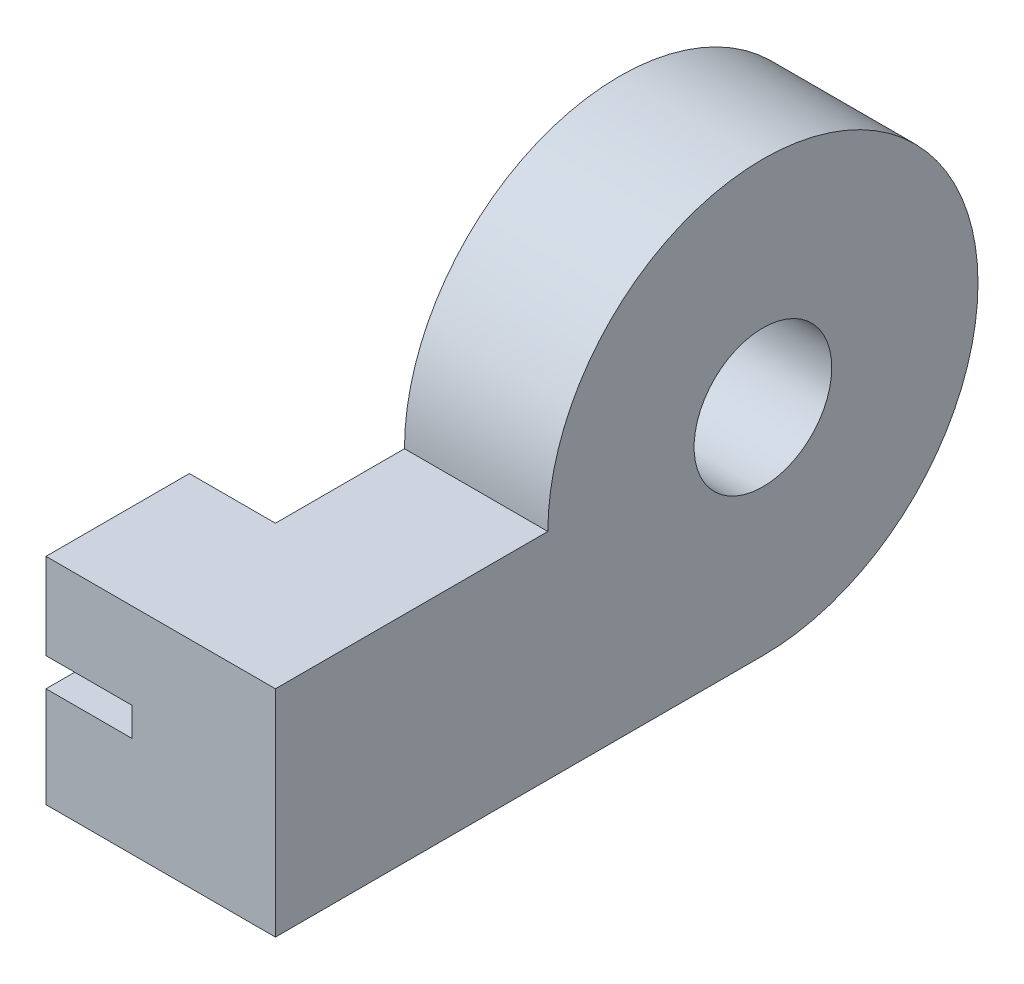
ISO-10303-21;
HEADER;
FILE_DESCRIPTION(('STEP AP214'),'2;1');
FILE_NAME('part.step','',(''),(''),'','','');
FILE_SCHEMA(('AUTOMOTIVE_DESIGN { 1 0 10303 214 1 1 1 1 }'));
ENDSEC;
DATA;
#1=APPLICATION_CONTEXT('core data for automotive mechanical design processes');
#2=APPLICATION_PROTOCOL_DEFINITION('international standard','automotive_design',2000,#1);
#3=PRODUCT_CONTEXT('',#1,'mechanical');
#4=PRODUCT('Part','Part','',(#3));
#5=PRODUCT_RELATED_PRODUCT_CATEGORY('part','',(#4));
#6=PRODUCT_DEFINITION_FORMATION('','',#4);
#7=PRODUCT_DEFINITION_CONTEXT('part definition',#1,'design');
#8=PRODUCT_DEFINITION('design','',#6,#7);
#9=PRODUCT_DEFINITION_SHAPE('','',#8);
#10=(LENGTH_UNIT() NAMED_UNIT(*) SI_UNIT(.MILLI.,.METRE.));
#11=(NAMED_UNIT(*) PLANE_ANGLE_UNIT() SI_UNIT($,.RADIAN.));
#12=(NAMED_UNIT(*) SI_UNIT($,.STERADIAN.) SOLID_ANGLE_UNIT());
#13=UNCERTAINTY_MEASURE_WITH_UNIT(LENGTH_MEASURE(1.E-05),#10,'distance_accuracy_value','');
#14=(GEOMETRIC_REPRESENTATION_CONTEXT(3) GLOBAL_UNCERTAINTY_ASSIGNED_CONTEXT((#13)) GLOBAL_UNIT_ASSIGNED_CONTEXT((#10,
#11,#12)) REPRESENTATION_CONTEXT('',''));
#15=CARTESIAN_POINT('',(0.,0.,0.));
#16=DIRECTION('',(0.,0.,1.));
#17=DIRECTION('',(1.,0.,0.));
#18=AXIS2_PLACEMENT_3D('',#15,#16,#17);
#19=CARTESIAN_POINT('',(0.,0.,0.));
#20=DIRECTION('',(1.,0.,0.));
#21=DIRECTION('',(0.,0.,-1.));
#22=AXIS2_PLACEMENT_3D('',#19,#20,#21);
#23=PLANE('',#22);
#24=CARTESIAN_POINT('',(0.,0.,0.));
#25=DIRECTION('',(1.,0.,0.));
#26=DIRECTION('',(0.,0.,-1.));
#27=AXIS2_PLACEMENT_3D('',#24,#25,#26);
#28=CIRCLE('',#27,3.048);
#29=CARTESIAN_POINT('',(0.,0.,-3.048));
#30=VERTEX_POINT('',#29);
#31=EDGE_CURVE('E190',#30,#30,#28,.T.);
#32=ORIENTED_EDGE('',*,*,#31,.T.);
#33=EDGE_LOOP('',(#32));
#34=FACE_BOUND('',#33,.T.);
#35=DIRECTION('',(0.,0.,-1.));
#36=VECTOR('',#35,1.);
#37=CARTESIAN_POINT('',(0.,-5.08000000000001,21.59));
#38=LINE('',#37,#36);
#39=CARTESIAN_POINT('',(0.,-5.08000000000001,21.59));
#40=VERTEX_POINT('',#39);
#41=CARTESIAN_POINT('',(0.,-5.08000000000001,15.24));
#42=VERTEX_POINT('',#41);
#43=EDGE_CURVE('E62',#40,#42,#38,.T.);
#44=ORIENTED_EDGE('',*,*,#43,.F.);
#45=DIRECTION('',(0.,1.,0.));
#46=VECTOR('',#45,1.);
#47=CARTESIAN_POINT('',(0.,0.,21.59));
#48=LINE('',#47,#46);
#49=CARTESIAN_POINT('',(0.,-3.81000000000001,21.59));
#50=VERTEX_POINT('',#49);
#51=EDGE_CURVE('E133',#40,#50,#48,.T.);
#52=ORIENTED_EDGE('',*,*,#51,.T.);
#53=DIRECTION('',(0.,0.,-1.));
#54=VECTOR('',#53,1.);
#55=CARTESIAN_POINT('',(0.,-3.81,21.59));
#56=LINE('',#55,#54);
#57=CARTESIAN_POINT('',(0.,-3.81000000000001,15.24));
#58=VERTEX_POINT('',#57);
#59=EDGE_CURVE('E173',#50,#58,#56,.T.);
#60=ORIENTED_EDGE('',*,*,#59,.T.);
#61=DIRECTION('',(0.,-1.,0.));
#62=VECTOR('',#61,1.);
#63=CARTESIAN_POINT('',(0.,0.,15.24));
#64=LINE('',#63,#62);
#65=CARTESIAN_POINT('',(0.,0.,15.24));
#66=VERTEX_POINT('',#65);
#67=EDGE_CURVE('E70',#66,#58,#64,.T.);
#68=ORIENTED_EDGE('',*,*,#67,.F.);
#69=DIRECTION('',(0.,0.,1.));
#70=VECTOR('',#69,1.);
#71=CARTESIAN_POINT('',(0.,0.,0.));
#72=LINE('',#71,#70);
#73=CARTESIAN_POINT('',(0.,0.,9.525));
#74=VERTEX_POINT('',#73);
#75=EDGE_CURVE('E145',#74,#66,#72,.T.);
#76=ORIENTED_EDGE('',*,*,#75,.F.);
#77=CARTESIAN_POINT('',(0.,0.,0.));
#78=DIRECTION('',(1.,0.,0.));
#79=DIRECTION('',(0.,0.,-1.));
#80=AXIS2_PLACEMENT_3D('',#77,#78,#79);
#81=CIRCLE('',#80,9.525);
#82=CARTESIAN_POINT('',(0.,-9.525,0.));
#83=VERTEX_POINT('',#82);
#84=EDGE_CURVE('E149',#83,#74,#81,.T.);
#85=ORIENTED_EDGE('',*,*,#84,.F.);
#86=DIRECTION('',(0.,0.,1.));
#87=VECTOR('',#86,1.);
#88=CARTESIAN_POINT('',(0.,-9.525,0.));
#89=LINE('',#88,#87);
#90=CARTESIAN_POINT('',(0.,-9.52500000000001,15.24));
#91=VERTEX_POINT('',#90);
#92=EDGE_CURVE('E144',#83,#91,#89,.T.);
#93=ORIENTED_EDGE('',*,*,#92,.T.);
#94=DIRECTION('',(0.,1.,0.));
#95=VECTOR('',#94,1.);
#96=CARTESIAN_POINT('',(0.,-9.52500000000001,15.24));
#97=LINE('',#96,#95);
#98=EDGE_CURVE('E137',#91,#42,#97,.T.);
#99=ORIENTED_EDGE('',*,*,#98,.T.);
#100=EDGE_LOOP('',(#44,#52,#60,#68,#76,#85,#93,#99));
#101=FACE_BOUND('',#100,.T.);
#102=ADVANCED_FACE('F47',(#34,#101),#23,.F.);
#103=CARTESIAN_POINT('',(6.35,0.,0.));
#104=DIRECTION('',(-1.,0.,0.));
#105=DIRECTION('',(0.,0.,1.));
#106=AXIS2_PLACEMENT_3D('',#103,#104,#105);
#107=CYLINDRICAL_SURFACE('',#106,9.525);
#108=ORIENTED_EDGE('',*,*,#84,.T.);
#109=DIRECTION('',(-1.,0.,0.));
#110=VECTOR('',#109,1.);
#111=CARTESIAN_POINT('',(6.35,0.,9.525));
#112=LINE('',#111,#110);
#113=CARTESIAN_POINT('',(6.35,0.,9.525));
#114=VERTEX_POINT('',#113);
#115=EDGE_CURVE('E13',#114,#74,#112,.T.);
#116=ORIENTED_EDGE('',*,*,#115,.F.);
#117=CARTESIAN_POINT('',(6.35,0.,0.));
#118=DIRECTION('',(1.,0.,0.));
#119=DIRECTION('',(0.,0.,-1.));
#120=AXIS2_PLACEMENT_3D('',#117,#118,#119);
#121=CIRCLE('',#120,9.525);
#122=CARTESIAN_POINT('',(6.35,-9.525,0.));
#123=VERTEX_POINT('',#122);
#124=EDGE_CURVE('E193',#123,#114,#121,.T.);
#125=ORIENTED_EDGE('',*,*,#124,.F.);
#126=DIRECTION('',(-1.,0.,0.));
#127=VECTOR('',#126,1.);
#128=CARTESIAN_POINT('',(6.35,-9.525,0.));
#129=LINE('',#128,#127);
#130=EDGE_CURVE('E153',#123,#83,#129,.T.);
#131=ORIENTED_EDGE('',*,*,#130,.T.);
#132=EDGE_LOOP('',(#108,#116,#125,#131));
#133=FACE_BOUND('',#132,.T.);
#134=ADVANCED_FACE('F206',(#133),#107,.T.);
#135=CARTESIAN_POINT('',(6.35,0.,0.));
#136=DIRECTION('',(0.,-1.,0.));
#137=DIRECTION('',(0.,0.,-1.));
#138=AXIS2_PLACEMENT_3D('',#135,#136,#137);
#139=PLANE('',#138);
#140=ORIENTED_EDGE('',*,*,#75,.T.);
#141=DIRECTION('',(1.,0.,0.));
#142=VECTOR('',#141,1.);
#143=CARTESIAN_POINT('',(-3.81,0.,15.24));
#144=LINE('',#143,#142);
#145=CARTESIAN_POINT('',(-3.81,0.,15.24));
#146=VERTEX_POINT('',#145);
#147=EDGE_CURVE('E170',#146,#66,#144,.T.);
#148=ORIENTED_EDGE('',*,*,#147,.F.);
#149=DIRECTION('',(0.,0.,-1.));
#150=VECTOR('',#149,1.);
#151=CARTESIAN_POINT('',(-3.81,0.,21.59));
#152=LINE('',#151,#150);
#153=CARTESIAN_POINT('',(-3.81,0.,21.59));
#154=VERTEX_POINT('',#153);
#155=EDGE_CURVE('E167',#154,#146,#152,.T.);
#156=ORIENTED_EDGE('',*,*,#155,.F.);
#157=DIRECTION('',(-1.,0.,0.));
#158=VECTOR('',#157,1.);
#159=CARTESIAN_POINT('',(6.35,0.,21.59));
#160=LINE('',#159,#158);
#161=CARTESIAN_POINT('',(6.35,0.,21.59));
#162=VERTEX_POINT('',#161);
#163=EDGE_CURVE('E55',#162,#154,#160,.T.);
#164=ORIENTED_EDGE('',*,*,#163,.F.);
#165=DIRECTION('',(0.,0.,1.));
#166=VECTOR('',#165,1.);
#167=CARTESIAN_POINT('',(6.35,0.,0.));
#168=LINE('',#167,#166);
#169=EDGE_CURVE('E196',#114,#162,#168,.T.);
#170=ORIENTED_EDGE('',*,*,#169,.F.);
#171=ORIENTED_EDGE('',*,*,#115,.T.);
#172=EDGE_LOOP('',(#140,#148,#156,#164,#170,#171));
#173=FACE_BOUND('',#172,.T.);
#174=ADVANCED_FACE('F168',(#173),#139,.F.);
#175=CARTESIAN_POINT('',(6.35,0.,21.59));
#176=DIRECTION('',(0.,0.,1.));
#177=DIRECTION('',(0.,-1.,0.));
#178=AXIS2_PLACEMENT_3D('',#175,#176,#177);
#179=PLANE('',#178);
#180=ORIENTED_EDGE('',*,*,#51,.F.);
#181=DIRECTION('',(1.,0.,0.));
#182=VECTOR('',#181,1.);
#183=CARTESIAN_POINT('',(-3.81,-5.08000000000001,21.59));
#184=LINE('',#183,#182);
#185=CARTESIAN_POINT('',(-3.81,-5.08000000000001,21.59));
#186=VERTEX_POINT('',#185);
#187=EDGE_CURVE('E124',#186,#40,#184,.T.);
#188=ORIENTED_EDGE('',*,*,#187,.F.);
#189=DIRECTION('',(0.,1.,0.));
#190=VECTOR('',#189,1.);
#191=CARTESIAN_POINT('',(-3.81,-9.52500000000001,21.59));
#192=LINE('',#191,#190);
#193=CARTESIAN_POINT('',(-3.81,-9.52500000000001,21.59));
#194=VERTEX_POINT('',#193);
#195=EDGE_CURVE('E217',#194,#186,#192,.T.);
#196=ORIENTED_EDGE('',*,*,#195,.F.);
#197=DIRECTION('',(-1.,0.,0.));
#198=VECTOR('',#197,1.);
#199=CARTESIAN_POINT('',(6.35,-9.52500000000001,21.59));
#200=LINE('',#199,#198);
#201=CARTESIAN_POINT('',(6.35,-9.52500000000001,21.59));
#202=VERTEX_POINT('',#201);
#203=EDGE_CURVE('E155',#202,#194,#200,.T.);
#204=ORIENTED_EDGE('',*,*,#203,.F.);
#205=DIRECTION('',(0.,1.,0.));
#206=VECTOR('',#205,1.);
#207=CARTESIAN_POINT('',(6.35,0.,21.59));
#208=LINE('',#207,#206);
#209=EDGE_CURVE('E163',#202,#162,#208,.T.);
#210=ORIENTED_EDGE('',*,*,#209,.T.);
#211=ORIENTED_EDGE('',*,*,#163,.T.);
#212=DIRECTION('',(0.,-1.,0.));
#213=VECTOR('',#212,1.);
#214=CARTESIAN_POINT('',(-3.81,0.,21.59));
#215=LINE('',#214,#213);
#216=CARTESIAN_POINT('',(-3.81,-3.81,21.59));
#217=VERTEX_POINT('',#216);
#218=EDGE_CURVE('E161',#154,#217,#215,.T.);
#219=ORIENTED_EDGE('',*,*,#218,.T.);
#220=DIRECTION('',(1.,0.,0.));
#221=VECTOR('',#220,1.);
#222=CARTESIAN_POINT('',(-3.81,-3.81,21.59));
#223=LINE('',#222,#221);
#224=EDGE_CURVE('E142',#217,#50,#223,.T.);
#225=ORIENTED_EDGE('',*,*,#224,.T.);
#226=EDGE_LOOP('',(#180,#188,#196,#204,#210,#211,#219,#225));
#227=FACE_BOUND('',#226,.T.);
#228=ADVANCED_FACE('F140',(#227),#179,.T.);
#229=CARTESIAN_POINT('',(6.35,0.,0.));
#230=DIRECTION('',(-1.,0.,0.));
#231=DIRECTION('',(0.,0.,1.));
#232=AXIS2_PLACEMENT_3D('',#229,#230,#231);
#233=CYLINDRICAL_SURFACE('',#232,3.048);
#234=CARTESIAN_POINT('',(6.35,0.,0.));
#235=DIRECTION('',(1.,0.,0.));
#236=DIRECTION('',(0.,0.,-1.));
#237=AXIS2_PLACEMENT_3D('',#234,#235,#236);
#238=CIRCLE('',#237,3.048);
#239=CARTESIAN_POINT('',(6.35,0.,-3.048));
#240=VERTEX_POINT('',#239);
#241=EDGE_CURVE('E147',#240,#240,#238,.T.);
#242=ORIENTED_EDGE('',*,*,#241,.T.);
#243=EDGE_LOOP('',(#242));
#244=FACE_BOUND('',#243,.T.);
#245=ORIENTED_EDGE('',*,*,#31,.F.);
#246=EDGE_LOOP('',(#245));
#247=FACE_BOUND('',#246,.T.);
#248=ADVANCED_FACE('F49',(#244,#247),#233,.F.);
#249=CARTESIAN_POINT('',(6.35,-9.525,0.));
#250=DIRECTION('',(0.,-1.,0.));
#251=DIRECTION('',(0.,0.,-1.));
#252=AXIS2_PLACEMENT_3D('',#249,#250,#251);
#253=PLANE('',#252);
#254=ORIENTED_EDGE('',*,*,#92,.F.);
#255=ORIENTED_EDGE('',*,*,#130,.F.);
#256=DIRECTION('',(0.,0.,1.));
#257=VECTOR('',#256,1.);
#258=CARTESIAN_POINT('',(6.35,-9.525,0.));
#259=LINE('',#258,#257);
#260=EDGE_CURVE('E156',#123,#202,#259,.T.);
#261=ORIENTED_EDGE('',*,*,#260,.T.);
#262=ORIENTED_EDGE('',*,*,#203,.T.);
#263=DIRECTION('',(0.,0.,-1.));
#264=VECTOR('',#263,1.);
#265=CARTESIAN_POINT('',(-3.81,-9.52500000000001,21.59));
#266=LINE('',#265,#264);
#267=CARTESIAN_POINT('',(-3.81,-9.52500000000001,15.24));
#268=VERTEX_POINT('',#267);
#269=EDGE_CURVE('E138',#194,#268,#266,.T.);
#270=ORIENTED_EDGE('',*,*,#269,.T.);
#271=DIRECTION('',(1.,0.,0.));
#272=VECTOR('',#271,1.);
#273=CARTESIAN_POINT('',(-3.81,-9.52500000000001,15.24));
#274=LINE('',#273,#272);
#275=EDGE_CURVE('E212',#268,#91,#274,.T.);
#276=ORIENTED_EDGE('',*,*,#275,.T.);
#277=EDGE_LOOP('',(#254,#255,#261,#262,#270,#276));
#278=FACE_BOUND('',#277,.T.);
#279=ADVANCED_FACE('F210',(#278),#253,.T.);
#280=CARTESIAN_POINT('',(6.35,0.,0.));
#281=DIRECTION('',(1.,0.,0.));
#282=DIRECTION('',(0.,0.,-1.));
#283=AXIS2_PLACEMENT_3D('',#280,#281,#282);
#284=PLANE('',#283);
#285=ORIENTED_EDGE('',*,*,#241,.F.);
#286=EDGE_LOOP('',(#285));
#287=FACE_BOUND('',#286,.T.);
#288=ORIENTED_EDGE('',*,*,#124,.T.);
#289=ORIENTED_EDGE('',*,*,#169,.T.);
#290=ORIENTED_EDGE('',*,*,#209,.F.);
#291=ORIENTED_EDGE('',*,*,#260,.F.);
#292=EDGE_LOOP('',(#288,#289,#290,#291));
#293=FACE_BOUND('',#292,.T.);
#294=ADVANCED_FACE('F238',(#287,#293),#284,.T.);
#295=CARTESIAN_POINT('',(-3.81,0.,15.24));
#296=DIRECTION('',(0.,0.,1.));
#297=DIRECTION('',(0.,-1.,0.));
#298=AXIS2_PLACEMENT_3D('',#295,#296,#297);
#299=PLANE('',#298);
#300=ORIENTED_EDGE('',*,*,#67,.T.);
#301=DIRECTION('',(1.,0.,0.));
#302=VECTOR('',#301,1.);
#303=CARTESIAN_POINT('',(-3.81,-3.81000000000001,15.24));
#304=LINE('',#303,#302);
#305=CARTESIAN_POINT('',(-3.81,-3.81000000000001,15.24));
#306=VERTEX_POINT('',#305);
#307=EDGE_CURVE('E180',#306,#58,#304,.T.);
#308=ORIENTED_EDGE('',*,*,#307,.F.);
#309=DIRECTION('',(0.,-1.,0.));
#310=VECTOR('',#309,1.);
#311=CARTESIAN_POINT('',(-3.81,0.,15.24));
#312=LINE('',#311,#310);
#313=EDGE_CURVE('E172',#146,#306,#312,.T.);
#314=ORIENTED_EDGE('',*,*,#313,.F.);
#315=ORIENTED_EDGE('',*,*,#147,.T.);
#316=EDGE_LOOP('',(#300,#308,#314,#315));
#317=FACE_BOUND('',#316,.T.);
#318=ADVANCED_FACE('F228',(#317),#299,.F.);
#319=CARTESIAN_POINT('',(-3.81,-3.81,21.59));
#320=DIRECTION('',(0.,-1.,0.));
#321=DIRECTION('',(0.,0.,-1.));
#322=AXIS2_PLACEMENT_3D('',#319,#320,#321);
#323=PLANE('',#322);
#324=ORIENTED_EDGE('',*,*,#59,.F.);
#325=ORIENTED_EDGE('',*,*,#224,.F.);
#326=DIRECTION('',(0.,0.,-1.));
#327=VECTOR('',#326,1.);
#328=CARTESIAN_POINT('',(-3.81,-3.81,21.59));
#329=LINE('',#328,#327);
#330=EDGE_CURVE('E178',#217,#306,#329,.T.);
#331=ORIENTED_EDGE('',*,*,#330,.T.);
#332=ORIENTED_EDGE('',*,*,#307,.T.);
#333=EDGE_LOOP('',(#324,#325,#331,#332));
#334=FACE_BOUND('',#333,.T.);
#335=ADVANCED_FACE('F230',(#334),#323,.T.);
#336=CARTESIAN_POINT('',(-3.81,0.,0.));
#337=DIRECTION('',(-1.,0.,0.));
#338=DIRECTION('',(0.,0.,1.));
#339=AXIS2_PLACEMENT_3D('',#336,#337,#338);
#340=PLANE('',#339);
#341=ORIENTED_EDGE('',*,*,#155,.T.);
#342=ORIENTED_EDGE('',*,*,#313,.T.);
#343=ORIENTED_EDGE('',*,*,#330,.F.);
#344=ORIENTED_EDGE('',*,*,#218,.F.);
#345=EDGE_LOOP('',(#341,#342,#343,#344));
#346=FACE_BOUND('',#345,.T.);
#347=ADVANCED_FACE('F176',(#346),#340,.T.);
#348=CARTESIAN_POINT('',(-3.81,-5.08000000000001,21.59));
#349=DIRECTION('',(0.,-1.,0.));
#350=DIRECTION('',(0.,0.,-1.));
#351=AXIS2_PLACEMENT_3D('',#348,#349,#350);
#352=PLANE('',#351);
#353=ORIENTED_EDGE('',*,*,#43,.T.);
#354=DIRECTION('',(1.,0.,0.));
#355=VECTOR('',#354,1.);
#356=CARTESIAN_POINT('',(-3.81,-5.08000000000001,15.24));
#357=LINE('',#356,#355);
#358=CARTESIAN_POINT('',(-3.81,-5.08000000000001,15.24));
#359=VERTEX_POINT('',#358);
#360=EDGE_CURVE('E130',#359,#42,#357,.T.);
#361=ORIENTED_EDGE('',*,*,#360,.F.);
#362=DIRECTION('',(0.,0.,-1.));
#363=VECTOR('',#362,1.);
#364=CARTESIAN_POINT('',(-3.81,-5.08000000000001,21.59));
#365=LINE('',#364,#363);
#366=EDGE_CURVE('E126',#186,#359,#365,.T.);
#367=ORIENTED_EDGE('',*,*,#366,.F.);
#368=ORIENTED_EDGE('',*,*,#187,.T.);
#369=EDGE_LOOP('',(#353,#361,#367,#368));
#370=FACE_BOUND('',#369,.T.);
#371=ADVANCED_FACE('F125',(#370),#352,.F.);
#372=CARTESIAN_POINT('',(-3.81,-9.52500000000001,15.24));
#373=DIRECTION('',(0.,0.,-1.));
#374=DIRECTION('',(0.,1.,0.));
#375=AXIS2_PLACEMENT_3D('',#372,#373,#374);
#376=PLANE('',#375);
#377=ORIENTED_EDGE('',*,*,#98,.F.);
#378=ORIENTED_EDGE('',*,*,#275,.F.);
#379=DIRECTION('',(0.,1.,0.));
#380=VECTOR('',#379,1.);
#381=CARTESIAN_POINT('',(-3.81,-9.52500000000001,15.24));
#382=LINE('',#381,#380);
#383=EDGE_CURVE('E224',#268,#359,#382,.T.);
#384=ORIENTED_EDGE('',*,*,#383,.T.);
#385=ORIENTED_EDGE('',*,*,#360,.T.);
#386=EDGE_LOOP('',(#377,#378,#384,#385));
#387=FACE_BOUND('',#386,.T.);
#388=ADVANCED_FACE('F219',(#387),#376,.T.);
#389=CARTESIAN_POINT('',(-3.81,0.,0.));
#390=DIRECTION('',(1.,0.,0.));
#391=DIRECTION('',(0.,0.,-1.));
#392=AXIS2_PLACEMENT_3D('',#389,#390,#391);
#393=PLANE('',#392);
#394=ORIENTED_EDGE('',*,*,#269,.F.);
#395=ORIENTED_EDGE('',*,*,#195,.T.);
#396=ORIENTED_EDGE('',*,*,#366,.T.);
#397=ORIENTED_EDGE('',*,*,#383,.F.);
#398=EDGE_LOOP('',(#394,#395,#396,#397));
#399=FACE_BOUND('',#398,.T.);
#400=ADVANCED_FACE('F308',(#399),#393,.F.);
#401=CLOSED_SHELL('',(#102,#134,#174,#228,#248,#279,#294,#318,#335,#347,#371,#388,#400));
#402=MANIFOLD_SOLID_BREP('B2',#401);
#403=ADVANCED_BREP_SHAPE_REPRESENTATION('',(#18,#402),#14);
#404=SHAPE_DEFINITION_REPRESENTATION(#9,#403);
ENDSEC;
END-ISO-10303-21;
